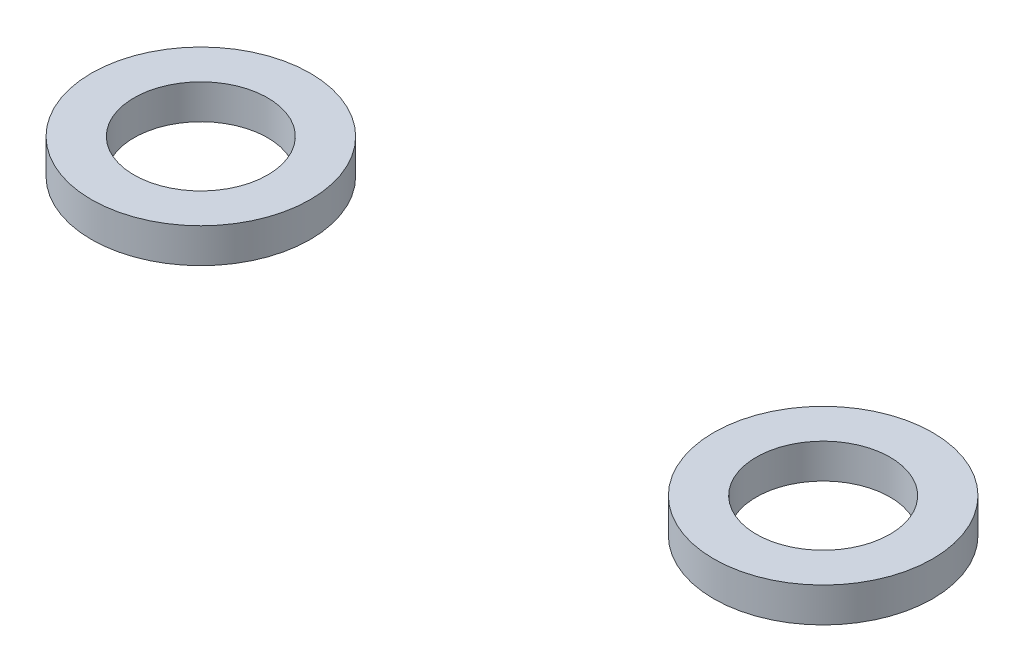
ISO-10303-21;
HEADER;
FILE_DESCRIPTION(('STEP AP214'),'2;1');
FILE_NAME('part.step','',(''),(''),'','','');
FILE_SCHEMA(('AUTOMOTIVE_DESIGN { 1 0 10303 214 1 1 1 1 }'));
ENDSEC;
DATA;
#1=APPLICATION_CONTEXT('core data for automotive mechanical design processes');
#2=APPLICATION_PROTOCOL_DEFINITION('international standard','automotive_design',2000,#1);
#3=PRODUCT_CONTEXT('',#1,'mechanical');
#4=PRODUCT('Part','Part','',(#3));
#5=PRODUCT_RELATED_PRODUCT_CATEGORY('part','',(#4));
#6=PRODUCT_DEFINITION_FORMATION('','',#4);
#7=PRODUCT_DEFINITION_CONTEXT('part definition',#1,'design');
#8=PRODUCT_DEFINITION('design','',#6,#7);
#9=PRODUCT_DEFINITION_SHAPE('','',#8);
#10=(LENGTH_UNIT() NAMED_UNIT(*) SI_UNIT(.MILLI.,.METRE.));
#11=(NAMED_UNIT(*) PLANE_ANGLE_UNIT() SI_UNIT($,.RADIAN.));
#12=(NAMED_UNIT(*) SI_UNIT($,.STERADIAN.) SOLID_ANGLE_UNIT());
#13=UNCERTAINTY_MEASURE_WITH_UNIT(LENGTH_MEASURE(1.E-05),#10,'distance_accuracy_value','');
#14=(GEOMETRIC_REPRESENTATION_CONTEXT(3) GLOBAL_UNCERTAINTY_ASSIGNED_CONTEXT((#13)) GLOBAL_UNIT_ASSIGNED_CONTEXT((#10,
#11,#12)) REPRESENTATION_CONTEXT('',''));
#15=CARTESIAN_POINT('',(0.,0.,0.));
#16=DIRECTION('',(0.,0.,1.));
#17=DIRECTION('',(1.,0.,0.));
#18=AXIS2_PLACEMENT_3D('',#15,#16,#17);
#19=CARTESIAN_POINT('',(-27.,-43.,108.));
#20=DIRECTION('',(0.,-1.,0.));
#21=DIRECTION('',(1.,0.,0.));
#22=AXIS2_PLACEMENT_3D('',#19,#20,#21);
#23=CYLINDRICAL_SURFACE('',#22,5.8);
#24=CARTESIAN_POINT('',(-27.,-46.,108.));
#25=DIRECTION('',(0.,-1.,0.));
#26=DIRECTION('',(1.,0.,0.));
#27=AXIS2_PLACEMENT_3D('',#24,#25,#26);
#28=CIRCLE('',#27,5.8);
#29=CARTESIAN_POINT('',(-21.2,-46.,108.));
#30=VERTEX_POINT('',#29);
#31=EDGE_CURVE('P0_E22',#30,#30,#28,.T.);
#32=ORIENTED_EDGE('',*,*,#31,.T.);
#33=EDGE_LOOP('',(#32));
#34=FACE_BOUND('',#33,.T.);
#35=CARTESIAN_POINT('',(-27.,-43.,108.));
#36=DIRECTION('',(0.,-1.,0.));
#37=DIRECTION('',(1.,0.,0.));
#38=AXIS2_PLACEMENT_3D('',#35,#36,#37);
#39=CIRCLE('',#38,5.8);
#40=CARTESIAN_POINT('',(-21.2,-43.,108.));
#41=VERTEX_POINT('',#40);
#42=EDGE_CURVE('P0_E10',#41,#41,#39,.T.);
#43=ORIENTED_EDGE('',*,*,#42,.F.);
#44=EDGE_LOOP('',(#43));
#45=FACE_BOUND('',#44,.T.);
#46=ADVANCED_FACE('P0_F15',(#34,#45),#23,.F.);
#47=CARTESIAN_POINT('',(-27.,-43.,108.));
#48=DIRECTION('',(0.,-1.,0.));
#49=DIRECTION('',(0.,0.,-1.));
#50=AXIS2_PLACEMENT_3D('',#47,#48,#49);
#51=PLANE('',#50);
#52=ORIENTED_EDGE('',*,*,#42,.T.);
#53=EDGE_LOOP('',(#52));
#54=FACE_BOUND('',#53,.T.);
#55=CARTESIAN_POINT('',(-27.,-43.,108.));
#56=DIRECTION('',(0.,-1.,0.));
#57=DIRECTION('',(1.,0.,0.));
#58=AXIS2_PLACEMENT_3D('',#55,#56,#57);
#59=CIRCLE('',#58,9.5);
#60=CARTESIAN_POINT('',(-17.5,-43.,108.));
#61=VERTEX_POINT('',#60);
#62=EDGE_CURVE('P0_E30',#61,#61,#59,.T.);
#63=ORIENTED_EDGE('',*,*,#62,.F.);
#64=EDGE_LOOP('',(#63));
#65=FACE_BOUND('',#64,.T.);
#66=ADVANCED_FACE('P0_F52',(#54,#65),#51,.F.);
#67=CARTESIAN_POINT('',(-27.,-46.,108.));
#68=DIRECTION('',(0.,-1.,0.));
#69=DIRECTION('',(0.,0.,-1.));
#70=AXIS2_PLACEMENT_3D('',#67,#68,#69);
#71=PLANE('',#70);
#72=ORIENTED_EDGE('',*,*,#31,.F.);
#73=EDGE_LOOP('',(#72));
#74=FACE_BOUND('',#73,.T.);
#75=CARTESIAN_POINT('',(-27.,-46.,108.));
#76=DIRECTION('',(0.,-1.,0.));
#77=DIRECTION('',(1.,0.,0.));
#78=AXIS2_PLACEMENT_3D('',#75,#76,#77);
#79=CIRCLE('',#78,9.5);
#80=CARTESIAN_POINT('',(-17.5,-46.,108.));
#81=VERTEX_POINT('',#80);
#82=EDGE_CURVE('P0_E36',#81,#81,#79,.T.);
#83=ORIENTED_EDGE('',*,*,#82,.T.);
#84=EDGE_LOOP('',(#83));
#85=FACE_BOUND('',#84,.T.);
#86=ADVANCED_FACE('P0_F44',(#74,#85),#71,.T.);
#87=CARTESIAN_POINT('',(-27.,-43.,108.));
#88=DIRECTION('',(0.,-1.,0.));
#89=DIRECTION('',(1.,0.,0.));
#90=AXIS2_PLACEMENT_3D('',#87,#88,#89);
#91=CYLINDRICAL_SURFACE('',#90,9.5);
#92=ORIENTED_EDGE('',*,*,#82,.F.);
#93=EDGE_LOOP('',(#92));
#94=FACE_BOUND('',#93,.T.);
#95=ORIENTED_EDGE('',*,*,#62,.T.);
#96=EDGE_LOOP('',(#95));
#97=FACE_BOUND('',#96,.T.);
#98=ADVANCED_FACE('P0_F46',(#94,#97),#91,.T.);
#99=CLOSED_SHELL('',(#46,#66,#86,#98));
#100=MANIFOLD_SOLID_BREP('P0_B1',#99);
#101=CARTESIAN_POINT('',(27.,-43.,108.));
#102=DIRECTION('',(0.,-1.,0.));
#103=DIRECTION('',(1.,0.,0.));
#104=AXIS2_PLACEMENT_3D('',#101,#102,#103);
#105=CYLINDRICAL_SURFACE('',#104,5.8);
#106=CARTESIAN_POINT('',(27.,-46.,108.));
#107=DIRECTION('',(0.,-1.,0.));
#108=DIRECTION('',(1.,0.,0.));
#109=AXIS2_PLACEMENT_3D('',#106,#107,#108);
#110=CIRCLE('',#109,5.8);
#111=CARTESIAN_POINT('',(32.8,-46.,108.));
#112=VERTEX_POINT('',#111);
#113=EDGE_CURVE('P1_E21',#112,#112,#110,.T.);
#114=ORIENTED_EDGE('',*,*,#113,.T.);
#115=EDGE_LOOP('',(#114));
#116=FACE_BOUND('',#115,.T.);
#117=CARTESIAN_POINT('',(27.,-43.,108.));
#118=DIRECTION('',(0.,-1.,0.));
#119=DIRECTION('',(1.,0.,0.));
#120=AXIS2_PLACEMENT_3D('',#117,#118,#119);
#121=CIRCLE('',#120,5.8);
#122=CARTESIAN_POINT('',(32.8,-43.,108.));
#123=VERTEX_POINT('',#122);
#124=EDGE_CURVE('P1_E9',#123,#123,#121,.T.);
#125=ORIENTED_EDGE('',*,*,#124,.F.);
#126=EDGE_LOOP('',(#125));
#127=FACE_BOUND('',#126,.T.);
#128=ADVANCED_FACE('P1_F14',(#116,#127),#105,.F.);
#129=CARTESIAN_POINT('',(27.,-43.,108.));
#130=DIRECTION('',(0.,-1.,0.));
#131=DIRECTION('',(0.,0.,-1.));
#132=AXIS2_PLACEMENT_3D('',#129,#130,#131);
#133=PLANE('',#132);
#134=ORIENTED_EDGE('',*,*,#124,.T.);
#135=EDGE_LOOP('',(#134));
#136=FACE_BOUND('',#135,.T.);
#137=CARTESIAN_POINT('',(27.,-43.,108.));
#138=DIRECTION('',(0.,-1.,0.));
#139=DIRECTION('',(1.,0.,0.));
#140=AXIS2_PLACEMENT_3D('',#137,#138,#139);
#141=CIRCLE('',#140,9.5);
#142=CARTESIAN_POINT('',(36.5,-43.,108.));
#143=VERTEX_POINT('',#142);
#144=EDGE_CURVE('P1_E29',#143,#143,#141,.T.);
#145=ORIENTED_EDGE('',*,*,#144,.F.);
#146=EDGE_LOOP('',(#145));
#147=FACE_BOUND('',#146,.T.);
#148=ADVANCED_FACE('P1_F51',(#136,#147),#133,.F.);
#149=CARTESIAN_POINT('',(27.,-46.,108.));
#150=DIRECTION('',(0.,-1.,0.));
#151=DIRECTION('',(0.,0.,-1.));
#152=AXIS2_PLACEMENT_3D('',#149,#150,#151);
#153=PLANE('',#152);
#154=ORIENTED_EDGE('',*,*,#113,.F.);
#155=EDGE_LOOP('',(#154));
#156=FACE_BOUND('',#155,.T.);
#157=CARTESIAN_POINT('',(27.,-46.,108.));
#158=DIRECTION('',(0.,-1.,0.));
#159=DIRECTION('',(1.,0.,0.));
#160=AXIS2_PLACEMENT_3D('',#157,#158,#159);
#161=CIRCLE('',#160,9.5);
#162=CARTESIAN_POINT('',(36.5,-46.,108.));
#163=VERTEX_POINT('',#162);
#164=EDGE_CURVE('P1_E35',#163,#163,#161,.T.);
#165=ORIENTED_EDGE('',*,*,#164,.T.);
#166=EDGE_LOOP('',(#165));
#167=FACE_BOUND('',#166,.T.);
#168=ADVANCED_FACE('P1_F43',(#156,#167),#153,.T.);
#169=CARTESIAN_POINT('',(27.,-43.,108.));
#170=DIRECTION('',(0.,-1.,0.));
#171=DIRECTION('',(1.,0.,0.));
#172=AXIS2_PLACEMENT_3D('',#169,#170,#171);
#173=CYLINDRICAL_SURFACE('',#172,9.5);
#174=ORIENTED_EDGE('',*,*,#164,.F.);
#175=EDGE_LOOP('',(#174));
#176=FACE_BOUND('',#175,.T.);
#177=ORIENTED_EDGE('',*,*,#144,.T.);
#178=EDGE_LOOP('',(#177));
#179=FACE_BOUND('',#178,.T.);
#180=ADVANCED_FACE('P1_F45',(#176,#179),#173,.T.);
#181=CLOSED_SHELL('',(#128,#148,#168,#180));
#182=MANIFOLD_SOLID_BREP('P1_B1',#181);
#183=ADVANCED_BREP_SHAPE_REPRESENTATION('',(#18,#100,#182),#14);
#184=SHAPE_DEFINITION_REPRESENTATION(#9,#183);
ENDSEC;
END-ISO-10303-21;
